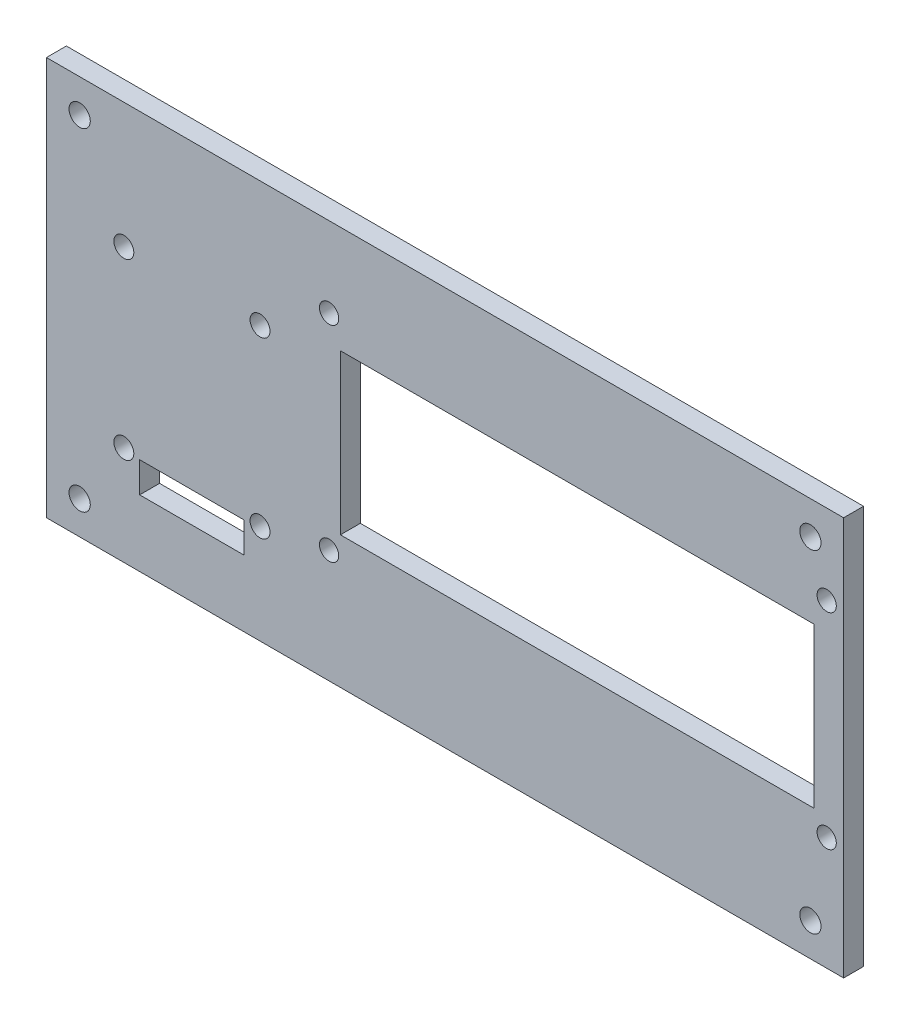
ISO-10303-21;
HEADER;
FILE_DESCRIPTION(('STEP AP214'),'2;1');
FILE_NAME('part.step','',(''),(''),'','','');
FILE_SCHEMA(('AUTOMOTIVE_DESIGN { 1 0 10303 214 1 1 1 1 }'));
ENDSEC;
DATA;
#1=APPLICATION_CONTEXT('core data for automotive mechanical design processes');
#2=APPLICATION_PROTOCOL_DEFINITION('international standard','automotive_design',2000,#1);
#3=PRODUCT_CONTEXT('',#1,'mechanical');
#4=PRODUCT('Part','Part','',(#3));
#5=PRODUCT_RELATED_PRODUCT_CATEGORY('part','',(#4));
#6=PRODUCT_DEFINITION_FORMATION('','',#4);
#7=PRODUCT_DEFINITION_CONTEXT('part definition',#1,'design');
#8=PRODUCT_DEFINITION('design','',#6,#7);
#9=PRODUCT_DEFINITION_SHAPE('','',#8);
#10=(LENGTH_UNIT() NAMED_UNIT(*) SI_UNIT(.MILLI.,.METRE.));
#11=(NAMED_UNIT(*) PLANE_ANGLE_UNIT() SI_UNIT($,.RADIAN.));
#12=(NAMED_UNIT(*) SI_UNIT($,.STERADIAN.) SOLID_ANGLE_UNIT());
#13=UNCERTAINTY_MEASURE_WITH_UNIT(LENGTH_MEASURE(1.E-05),#10,'distance_accuracy_value','');
#14=(GEOMETRIC_REPRESENTATION_CONTEXT(3) GLOBAL_UNCERTAINTY_ASSIGNED_CONTEXT((#13)) GLOBAL_UNIT_ASSIGNED_CONTEXT((#10,
#11,#12)) REPRESENTATION_CONTEXT('',''));
#15=CARTESIAN_POINT('',(0.,0.,0.));
#16=DIRECTION('',(0.,0.,1.));
#17=DIRECTION('',(1.,0.,0.));
#18=AXIS2_PLACEMENT_3D('',#15,#16,#17);
#19=CARTESIAN_POINT('',(-56.9074242581543,24.3699731903485,3.));
#20=DIRECTION('',(1.,0.,0.));
#21=DIRECTION('',(0.,1.,0.));
#22=AXIS2_PLACEMENT_3D('',#19,#20,#21);
#23=PLANE('',#22);
#24=DIRECTION('',(0.,-1.,0.));
#25=VECTOR('',#24,1.);
#26=CARTESIAN_POINT('',(-56.9074242581543,24.3699731903485,0.));
#27=LINE('',#26,#25);
#28=CARTESIAN_POINT('',(-56.9074242581543,24.3699731903485,0.));
#29=VERTEX_POINT('',#28);
#30=CARTESIAN_POINT('',(-56.9074242581543,-35.6300268096515,0.));
#31=VERTEX_POINT('',#30);
#32=EDGE_CURVE('E244',#29,#31,#27,.T.);
#33=ORIENTED_EDGE('',*,*,#32,.T.);
#34=DIRECTION('',(0.,0.,-1.));
#35=VECTOR('',#34,1.);
#36=CARTESIAN_POINT('',(-56.9074242581543,-35.6300268096515,3.));
#37=LINE('',#36,#35);
#38=CARTESIAN_POINT('',(-56.9074242581543,-35.6300268096515,3.));
#39=VERTEX_POINT('',#38);
#40=EDGE_CURVE('E11',#39,#31,#37,.T.);
#41=ORIENTED_EDGE('',*,*,#40,.F.);
#42=DIRECTION('',(0.,-1.,0.));
#43=VECTOR('',#42,1.);
#44=CARTESIAN_POINT('',(-56.9074242581543,24.3699731903485,3.));
#45=LINE('',#44,#43);
#46=CARTESIAN_POINT('',(-56.9074242581543,24.3699731903485,3.));
#47=VERTEX_POINT('',#46);
#48=EDGE_CURVE('E247',#47,#39,#45,.T.);
#49=ORIENTED_EDGE('',*,*,#48,.F.);
#50=DIRECTION('',(0.,0.,-1.));
#51=VECTOR('',#50,1.);
#52=CARTESIAN_POINT('',(-56.9074242581543,24.3699731903485,3.));
#53=LINE('',#52,#51);
#54=EDGE_CURVE('E257',#47,#29,#53,.T.);
#55=ORIENTED_EDGE('',*,*,#54,.T.);
#56=EDGE_LOOP('',(#33,#41,#49,#55));
#57=FACE_BOUND('',#56,.T.);
#58=ADVANCED_FACE('F32',(#57),#23,.F.);
#59=CARTESIAN_POINT('',(-56.9074242581543,-35.6300268096515,3.));
#60=DIRECTION('',(0.,1.,0.));
#61=DIRECTION('',(0.,0.,1.));
#62=AXIS2_PLACEMENT_3D('',#59,#60,#61);
#63=PLANE('',#62);
#64=DIRECTION('',(1.,0.,0.));
#65=VECTOR('',#64,1.);
#66=CARTESIAN_POINT('',(-56.9074242581543,-35.6300268096515,0.));
#67=LINE('',#66,#65);
#68=CARTESIAN_POINT('',(63.0925757418457,-35.6300268096515,0.));
#69=VERTEX_POINT('',#68);
#70=EDGE_CURVE('E260',#31,#69,#67,.T.);
#71=ORIENTED_EDGE('',*,*,#70,.T.);
#72=DIRECTION('',(0.,0.,-1.));
#73=VECTOR('',#72,1.);
#74=CARTESIAN_POINT('',(63.0925757418457,-35.6300268096515,3.));
#75=LINE('',#74,#73);
#76=CARTESIAN_POINT('',(63.0925757418457,-35.6300268096515,3.));
#77=VERTEX_POINT('',#76);
#78=EDGE_CURVE('E39',#77,#69,#75,.T.);
#79=ORIENTED_EDGE('',*,*,#78,.F.);
#80=DIRECTION('',(1.,0.,0.));
#81=VECTOR('',#80,1.);
#82=CARTESIAN_POINT('',(-56.9074242581543,-35.6300268096515,3.));
#83=LINE('',#82,#81);
#84=EDGE_CURVE('E250',#39,#77,#83,.T.);
#85=ORIENTED_EDGE('',*,*,#84,.F.);
#86=ORIENTED_EDGE('',*,*,#40,.T.);
#87=EDGE_LOOP('',(#71,#79,#85,#86));
#88=FACE_BOUND('',#87,.T.);
#89=ADVANCED_FACE('F289',(#88),#63,.F.);
#90=CARTESIAN_POINT('',(63.0925757418457,24.3699731903485,3.));
#91=DIRECTION('',(-1.,0.,0.));
#92=DIRECTION('',(0.,0.,1.));
#93=AXIS2_PLACEMENT_3D('',#90,#91,#92);
#94=PLANE('',#93);
#95=DIRECTION('',(0.,1.,0.));
#96=VECTOR('',#95,1.);
#97=CARTESIAN_POINT('',(63.0925757418457,24.3699731903485,0.));
#98=LINE('',#97,#96);
#99=CARTESIAN_POINT('',(63.0925757418457,24.3699731903485,0.));
#100=VERTEX_POINT('',#99);
#101=EDGE_CURVE('E262',#69,#100,#98,.T.);
#102=ORIENTED_EDGE('',*,*,#101,.T.);
#103=DIRECTION('',(0.,0.,-1.));
#104=VECTOR('',#103,1.);
#105=CARTESIAN_POINT('',(63.0925757418457,24.3699731903485,3.));
#106=LINE('',#105,#104);
#107=CARTESIAN_POINT('',(63.0925757418457,24.3699731903485,3.));
#108=VERTEX_POINT('',#107);
#109=EDGE_CURVE('E267',#108,#100,#106,.T.);
#110=ORIENTED_EDGE('',*,*,#109,.F.);
#111=DIRECTION('',(0.,1.,0.));
#112=VECTOR('',#111,1.);
#113=CARTESIAN_POINT('',(63.0925757418457,24.3699731903485,3.));
#114=LINE('',#113,#112);
#115=EDGE_CURVE('E253',#77,#108,#114,.T.);
#116=ORIENTED_EDGE('',*,*,#115,.F.);
#117=ORIENTED_EDGE('',*,*,#78,.T.);
#118=EDGE_LOOP('',(#102,#110,#116,#117));
#119=FACE_BOUND('',#118,.T.);
#120=ADVANCED_FACE('F274',(#119),#94,.F.);
#121=CARTESIAN_POINT('',(-56.9074242581543,24.3699731903485,3.));
#122=DIRECTION('',(0.,-1.,0.));
#123=DIRECTION('',(0.,0.,-1.));
#124=AXIS2_PLACEMENT_3D('',#121,#122,#123);
#125=PLANE('',#124);
#126=DIRECTION('',(-1.,0.,0.));
#127=VECTOR('',#126,1.);
#128=CARTESIAN_POINT('',(-56.9074242581543,24.3699731903485,0.));
#129=LINE('',#128,#127);
#130=EDGE_CURVE('E251',#100,#29,#129,.T.);
#131=ORIENTED_EDGE('',*,*,#130,.T.);
#132=ORIENTED_EDGE('',*,*,#54,.F.);
#133=DIRECTION('',(-1.,0.,0.));
#134=VECTOR('',#133,1.);
#135=CARTESIAN_POINT('',(-56.9074242581543,24.3699731903485,3.));
#136=LINE('',#135,#134);
#137=EDGE_CURVE('E255',#108,#47,#136,.T.);
#138=ORIENTED_EDGE('',*,*,#137,.F.);
#139=ORIENTED_EDGE('',*,*,#109,.T.);
#140=EDGE_LOOP('',(#131,#132,#138,#139));
#141=FACE_BOUND('',#140,.T.);
#142=ADVANCED_FACE('F282',(#141),#125,.F.);
#143=CARTESIAN_POINT('',(0.,0.,3.));
#144=DIRECTION('',(0.,0.,1.));
#145=DIRECTION('',(1.,0.,0.));
#146=AXIS2_PLACEMENT_3D('',#143,#144,#145);
#147=PLANE('',#146);
#148=DIRECTION('',(0.,-1.,0.));
#149=VECTOR('',#148,1.);
#150=CARTESIAN_POINT('',(-42.8746504453613,-25.6300268096515,3.));
#151=LINE('',#150,#149);
#152=CARTESIAN_POINT('',(-42.8746504453613,-21.0438341045319,3.));
#153=VERTEX_POINT('',#152);
#154=CARTESIAN_POINT('',(-42.8746504453613,-25.6300268096515,3.));
#155=VERTEX_POINT('',#154);
#156=EDGE_CURVE('E46',#153,#155,#151,.T.);
#157=ORIENTED_EDGE('',*,*,#156,.F.);
#158=DIRECTION('',(-1.,0.,0.));
#159=VECTOR('',#158,1.);
#160=CARTESIAN_POINT('',(-42.8746504453613,-21.0438341045319,3.));
#161=LINE('',#160,#159);
#162=CARTESIAN_POINT('',(-27.184872325898,-21.0438341045319,3.));
#163=VERTEX_POINT('',#162);
#164=EDGE_CURVE('E138',#163,#153,#161,.T.);
#165=ORIENTED_EDGE('',*,*,#164,.F.);
#166=DIRECTION('',(0.,1.,0.));
#167=VECTOR('',#166,1.);
#168=CARTESIAN_POINT('',(-27.184872325898,-25.6300268096515,3.));
#169=LINE('',#168,#167);
#170=CARTESIAN_POINT('',(-27.184872325898,-25.6300268096515,3.));
#171=VERTEX_POINT('',#170);
#172=EDGE_CURVE('E141',#171,#163,#169,.T.);
#173=ORIENTED_EDGE('',*,*,#172,.F.);
#174=DIRECTION('',(1.,0.,0.));
#175=VECTOR('',#174,1.);
#176=CARTESIAN_POINT('',(-42.8746504453613,-25.6300268096515,3.));
#177=LINE('',#176,#175);
#178=EDGE_CURVE('E150',#155,#171,#177,.T.);
#179=ORIENTED_EDGE('',*,*,#178,.F.);
#180=EDGE_LOOP('',(#157,#165,#173,#179));
#181=FACE_BOUND('',#180,.T.);
#182=CARTESIAN_POINT('',(-45.2574242581544,-20.6800268096515,3.));
#183=DIRECTION('',(0.,0.,1.));
#184=DIRECTION('',(1.,0.,0.));
#185=AXIS2_PLACEMENT_3D('',#182,#183,#184);
#186=CIRCLE('',#185,1.5);
#187=CARTESIAN_POINT('',(-43.7574242581544,-20.6800268096515,3.));
#188=VERTEX_POINT('',#187);
#189=EDGE_CURVE('E144',#188,#188,#186,.T.);
#190=ORIENTED_EDGE('',*,*,#189,.F.);
#191=EDGE_LOOP('',(#190));
#192=FACE_BOUND('',#191,.T.);
#193=CARTESIAN_POINT('',(-24.7574242581543,-20.6800268096515,3.));
#194=DIRECTION('',(0.,0.,1.));
#195=DIRECTION('',(1.,0.,0.));
#196=AXIS2_PLACEMENT_3D('',#193,#194,#195);
#197=CIRCLE('',#196,1.5);
#198=CARTESIAN_POINT('',(-23.2574242581543,-20.6800268096515,3.));
#199=VERTEX_POINT('',#198);
#200=EDGE_CURVE('E391',#199,#199,#197,.T.);
#201=ORIENTED_EDGE('',*,*,#200,.F.);
#202=EDGE_LOOP('',(#201));
#203=FACE_BOUND('',#202,.T.);
#204=CARTESIAN_POINT('',(-24.7574242581543,5.51997319034853,3.));
#205=DIRECTION('',(0.,0.,1.));
#206=DIRECTION('',(1.,0.,0.));
#207=AXIS2_PLACEMENT_3D('',#204,#205,#206);
#208=CIRCLE('',#207,1.5);
#209=CARTESIAN_POINT('',(-23.2574242581543,5.51997319034853,3.));
#210=VERTEX_POINT('',#209);
#211=EDGE_CURVE('E385',#210,#210,#208,.T.);
#212=ORIENTED_EDGE('',*,*,#211,.F.);
#213=EDGE_LOOP('',(#212));
#214=FACE_BOUND('',#213,.T.);
#215=CARTESIAN_POINT('',(-45.2574242581544,5.51997319034853,3.));
#216=DIRECTION('',(0.,0.,1.));
#217=DIRECTION('',(1.,0.,0.));
#218=AXIS2_PLACEMENT_3D('',#215,#216,#217);
#219=CIRCLE('',#218,1.5);
#220=CARTESIAN_POINT('',(-43.7574242581544,5.51997319034853,3.));
#221=VERTEX_POINT('',#220);
#222=EDGE_CURVE('E163',#221,#221,#219,.T.);
#223=ORIENTED_EDGE('',*,*,#222,.F.);
#224=EDGE_LOOP('',(#223));
#225=FACE_BOUND('',#224,.T.);
#226=DIRECTION('',(0.,-1.,0.));
#227=VECTOR('',#226,1.);
#228=CARTESIAN_POINT('',(-12.6574242581543,8.26997319034854,3.));
#229=LINE('',#228,#227);
#230=CARTESIAN_POINT('',(-12.6574242581543,8.26997319034854,3.));
#231=VERTEX_POINT('',#230);
#232=CARTESIAN_POINT('',(-12.6574242581543,-15.7300268096515,3.));
#233=VERTEX_POINT('',#232);
#234=EDGE_CURVE('E162',#231,#233,#229,.T.);
#235=ORIENTED_EDGE('',*,*,#234,.F.);
#236=DIRECTION('',(-1.,0.,0.));
#237=VECTOR('',#236,1.);
#238=CARTESIAN_POINT('',(-12.6574242581543,8.26997319034854,3.));
#239=LINE('',#238,#237);
#240=CARTESIAN_POINT('',(58.6425757418457,8.26997319034854,3.));
#241=VERTEX_POINT('',#240);
#242=EDGE_CURVE('E171',#241,#231,#239,.T.);
#243=ORIENTED_EDGE('',*,*,#242,.F.);
#244=DIRECTION('',(0.,1.,0.));
#245=VECTOR('',#244,1.);
#246=CARTESIAN_POINT('',(58.6425757418457,8.26997319034854,3.));
#247=LINE('',#246,#245);
#248=CARTESIAN_POINT('',(58.6425757418457,-15.7300268096515,3.));
#249=VERTEX_POINT('',#248);
#250=EDGE_CURVE('E185',#249,#241,#247,.T.);
#251=ORIENTED_EDGE('',*,*,#250,.F.);
#252=DIRECTION('',(1.,0.,0.));
#253=VECTOR('',#252,1.);
#254=CARTESIAN_POINT('',(-12.6574242581543,-15.7300268096515,3.));
#255=LINE('',#254,#253);
#256=EDGE_CURVE('E182',#233,#249,#255,.T.);
#257=ORIENTED_EDGE('',*,*,#256,.F.);
#258=EDGE_LOOP('',(#235,#243,#251,#257));
#259=FACE_BOUND('',#258,.T.);
#260=CARTESIAN_POINT('',(60.5425757418456,12.3199731903485,3.));
#261=DIRECTION('',(0.,0.,-1.));
#262=DIRECTION('',(-1.,0.,0.));
#263=AXIS2_PLACEMENT_3D('',#260,#261,#262);
#264=CIRCLE('',#263,1.45);
#265=CARTESIAN_POINT('',(59.0925757418456,12.3199731903485,3.));
#266=VERTEX_POINT('',#265);
#267=EDGE_CURVE('E212',#266,#266,#264,.T.);
#268=ORIENTED_EDGE('',*,*,#267,.T.);
#269=EDGE_LOOP('',(#268));
#270=FACE_BOUND('',#269,.T.);
#271=CARTESIAN_POINT('',(60.5425757418456,-18.5800268096515,3.));
#272=DIRECTION('',(0.,0.,-1.));
#273=DIRECTION('',(-1.,0.,0.));
#274=AXIS2_PLACEMENT_3D('',#271,#272,#273);
#275=CIRCLE('',#274,1.45);
#276=CARTESIAN_POINT('',(59.0925757418456,-18.5800268096515,3.));
#277=VERTEX_POINT('',#276);
#278=EDGE_CURVE('E206',#277,#277,#275,.T.);
#279=ORIENTED_EDGE('',*,*,#278,.T.);
#280=EDGE_LOOP('',(#279));
#281=FACE_BOUND('',#280,.T.);
#282=CARTESIAN_POINT('',(-14.3574242581543,-18.5800268096515,3.));
#283=DIRECTION('',(0.,0.,-1.));
#284=DIRECTION('',(-1.,0.,0.));
#285=AXIS2_PLACEMENT_3D('',#282,#283,#284);
#286=CIRCLE('',#285,1.45);
#287=CARTESIAN_POINT('',(-15.8074242581543,-18.5800268096515,3.));
#288=VERTEX_POINT('',#287);
#289=EDGE_CURVE('E199',#288,#288,#286,.T.);
#290=ORIENTED_EDGE('',*,*,#289,.T.);
#291=EDGE_LOOP('',(#290));
#292=FACE_BOUND('',#291,.T.);
#293=CARTESIAN_POINT('',(-14.3574242581543,12.3199731903485,3.));
#294=DIRECTION('',(0.,0.,-1.));
#295=DIRECTION('',(-1.,0.,0.));
#296=AXIS2_PLACEMENT_3D('',#293,#294,#295);
#297=CIRCLE('',#296,1.45);
#298=CARTESIAN_POINT('',(-15.8074242581543,12.3199731903485,3.));
#299=VERTEX_POINT('',#298);
#300=EDGE_CURVE('E217',#299,#299,#297,.T.);
#301=ORIENTED_EDGE('',*,*,#300,.T.);
#302=EDGE_LOOP('',(#301));
#303=FACE_BOUND('',#302,.T.);
#304=CARTESIAN_POINT('',(-51.9074242581543,19.3699731903485,3.));
#305=DIRECTION('',(0.,0.,1.));
#306=DIRECTION('',(1.,0.,0.));
#307=AXIS2_PLACEMENT_3D('',#304,#305,#306);
#308=CIRCLE('',#307,1.6);
#309=CARTESIAN_POINT('',(-50.3074242581543,19.3699731903485,3.));
#310=VERTEX_POINT('',#309);
#311=EDGE_CURVE('E220',#310,#310,#308,.T.);
#312=ORIENTED_EDGE('',*,*,#311,.F.);
#313=EDGE_LOOP('',(#312));
#314=FACE_BOUND('',#313,.T.);
#315=CARTESIAN_POINT('',(-51.9074242581543,-30.6300268096515,3.));
#316=DIRECTION('',(0.,0.,1.));
#317=DIRECTION('',(1.,0.,0.));
#318=AXIS2_PLACEMENT_3D('',#315,#316,#317);
#319=CIRCLE('',#318,1.6);
#320=CARTESIAN_POINT('',(-50.3074242581543,-30.6300268096515,3.));
#321=VERTEX_POINT('',#320);
#322=EDGE_CURVE('E233',#321,#321,#319,.T.);
#323=ORIENTED_EDGE('',*,*,#322,.F.);
#324=EDGE_LOOP('',(#323));
#325=FACE_BOUND('',#324,.T.);
#326=CARTESIAN_POINT('',(58.0925757418457,-30.6300268096515,3.));
#327=DIRECTION('',(0.,0.,1.));
#328=DIRECTION('',(1.,0.,0.));
#329=AXIS2_PLACEMENT_3D('',#326,#327,#328);
#330=CIRCLE('',#329,1.6);
#331=CARTESIAN_POINT('',(59.6925757418457,-30.6300268096515,3.));
#332=VERTEX_POINT('',#331);
#333=EDGE_CURVE('E227',#332,#332,#330,.T.);
#334=ORIENTED_EDGE('',*,*,#333,.F.);
#335=EDGE_LOOP('',(#334));
#336=FACE_BOUND('',#335,.T.);
#337=CARTESIAN_POINT('',(58.0925757418457,19.3699731903485,3.));
#338=DIRECTION('',(0.,0.,1.));
#339=DIRECTION('',(1.,0.,0.));
#340=AXIS2_PLACEMENT_3D('',#337,#338,#339);
#341=CIRCLE('',#340,1.6);
#342=CARTESIAN_POINT('',(59.6925757418457,19.3699731903485,3.));
#343=VERTEX_POINT('',#342);
#344=EDGE_CURVE('E226',#343,#343,#341,.T.);
#345=ORIENTED_EDGE('',*,*,#344,.F.);
#346=EDGE_LOOP('',(#345));
#347=FACE_BOUND('',#346,.T.);
#348=ORIENTED_EDGE('',*,*,#48,.T.);
#349=ORIENTED_EDGE('',*,*,#84,.T.);
#350=ORIENTED_EDGE('',*,*,#115,.T.);
#351=ORIENTED_EDGE('',*,*,#137,.T.);
#352=EDGE_LOOP('',(#348,#349,#350,#351));
#353=FACE_BOUND('',#352,.T.);
#354=ADVANCED_FACE('F288',(#181,#192,#203,#214,#225,#259,#270,#281,#292,#303,#314,#325,#336,
#347,#353),#147,.T.);
#355=CARTESIAN_POINT('',(0.,0.,0.));
#356=DIRECTION('',(0.,0.,1.));
#357=DIRECTION('',(1.,0.,0.));
#358=AXIS2_PLACEMENT_3D('',#355,#356,#357);
#359=PLANE('',#358);
#360=DIRECTION('',(-1.,0.,0.));
#361=VECTOR('',#360,1.);
#362=CARTESIAN_POINT('',(-42.8746504453613,-21.0438341045319,0.));
#363=LINE('',#362,#361);
#364=CARTESIAN_POINT('',(-27.184872325898,-21.0438341045319,0.));
#365=VERTEX_POINT('',#364);
#366=CARTESIAN_POINT('',(-42.8746504453613,-21.0438341045319,0.));
#367=VERTEX_POINT('',#366);
#368=EDGE_CURVE('E128',#365,#367,#363,.T.);
#369=ORIENTED_EDGE('',*,*,#368,.T.);
#370=DIRECTION('',(0.,-1.,0.));
#371=VECTOR('',#370,1.);
#372=CARTESIAN_POINT('',(-42.8746504453613,-25.6300268096515,0.));
#373=LINE('',#372,#371);
#374=CARTESIAN_POINT('',(-42.8746504453613,-25.6300268096515,0.));
#375=VERTEX_POINT('',#374);
#376=EDGE_CURVE('E122',#367,#375,#373,.T.);
#377=ORIENTED_EDGE('',*,*,#376,.T.);
#378=DIRECTION('',(1.,0.,0.));
#379=VECTOR('',#378,1.);
#380=CARTESIAN_POINT('',(-42.8746504453613,-25.6300268096515,0.));
#381=LINE('',#380,#379);
#382=CARTESIAN_POINT('',(-27.184872325898,-25.6300268096515,0.));
#383=VERTEX_POINT('',#382);
#384=EDGE_CURVE('E131',#375,#383,#381,.T.);
#385=ORIENTED_EDGE('',*,*,#384,.T.);
#386=DIRECTION('',(0.,1.,0.));
#387=VECTOR('',#386,1.);
#388=CARTESIAN_POINT('',(-27.184872325898,-25.6300268096515,0.));
#389=LINE('',#388,#387);
#390=EDGE_CURVE('E54',#383,#365,#389,.T.);
#391=ORIENTED_EDGE('',*,*,#390,.T.);
#392=EDGE_LOOP('',(#369,#377,#385,#391));
#393=FACE_BOUND('',#392,.T.);
#394=CARTESIAN_POINT('',(-45.2574242581544,-20.6800268096515,0.));
#395=DIRECTION('',(0.,0.,1.));
#396=DIRECTION('',(1.,0.,0.));
#397=AXIS2_PLACEMENT_3D('',#394,#395,#396);
#398=CIRCLE('',#397,1.5);
#399=CARTESIAN_POINT('',(-43.7574242581544,-20.6800268096515,0.));
#400=VERTEX_POINT('',#399);
#401=EDGE_CURVE('E395',#400,#400,#398,.T.);
#402=ORIENTED_EDGE('',*,*,#401,.T.);
#403=EDGE_LOOP('',(#402));
#404=FACE_BOUND('',#403,.T.);
#405=CARTESIAN_POINT('',(-24.7574242581543,-20.6800268096515,0.));
#406=DIRECTION('',(0.,0.,1.));
#407=DIRECTION('',(1.,0.,0.));
#408=AXIS2_PLACEMENT_3D('',#405,#406,#407);
#409=CIRCLE('',#408,1.5);
#410=CARTESIAN_POINT('',(-23.2574242581543,-20.6800268096515,0.));
#411=VERTEX_POINT('',#410);
#412=EDGE_CURVE('E387',#411,#411,#409,.T.);
#413=ORIENTED_EDGE('',*,*,#412,.T.);
#414=EDGE_LOOP('',(#413));
#415=FACE_BOUND('',#414,.T.);
#416=CARTESIAN_POINT('',(-24.7574242581543,5.51997319034853,0.));
#417=DIRECTION('',(0.,0.,1.));
#418=DIRECTION('',(1.,0.,0.));
#419=AXIS2_PLACEMENT_3D('',#416,#417,#418);
#420=CIRCLE('',#419,1.5);
#421=CARTESIAN_POINT('',(-23.2574242581543,5.51997319034853,0.));
#422=VERTEX_POINT('',#421);
#423=EDGE_CURVE('E166',#422,#422,#420,.T.);
#424=ORIENTED_EDGE('',*,*,#423,.T.);
#425=EDGE_LOOP('',(#424));
#426=FACE_BOUND('',#425,.T.);
#427=CARTESIAN_POINT('',(-45.2574242581544,5.51997319034853,0.));
#428=DIRECTION('',(0.,0.,1.));
#429=DIRECTION('',(1.,0.,0.));
#430=AXIS2_PLACEMENT_3D('',#427,#428,#429);
#431=CIRCLE('',#430,1.5);
#432=CARTESIAN_POINT('',(-43.7574242581544,5.51997319034853,0.));
#433=VERTEX_POINT('',#432);
#434=EDGE_CURVE('E159',#433,#433,#431,.T.);
#435=ORIENTED_EDGE('',*,*,#434,.T.);
#436=EDGE_LOOP('',(#435));
#437=FACE_BOUND('',#436,.T.);
#438=DIRECTION('',(-1.,0.,0.));
#439=VECTOR('',#438,1.);
#440=CARTESIAN_POINT('',(-12.6574242581543,8.26997319034854,0.));
#441=LINE('',#440,#439);
#442=CARTESIAN_POINT('',(58.6425757418457,8.26997319034854,0.));
#443=VERTEX_POINT('',#442);
#444=CARTESIAN_POINT('',(-12.6574242581543,8.26997319034854,0.));
#445=VERTEX_POINT('',#444);
#446=EDGE_CURVE('E177',#443,#445,#441,.T.);
#447=ORIENTED_EDGE('',*,*,#446,.T.);
#448=DIRECTION('',(0.,-1.,0.));
#449=VECTOR('',#448,1.);
#450=CARTESIAN_POINT('',(-12.6574242581543,8.26997319034854,0.));
#451=LINE('',#450,#449);
#452=CARTESIAN_POINT('',(-12.6574242581543,-15.7300268096515,0.));
#453=VERTEX_POINT('',#452);
#454=EDGE_CURVE('E167',#445,#453,#451,.T.);
#455=ORIENTED_EDGE('',*,*,#454,.T.);
#456=DIRECTION('',(1.,0.,0.));
#457=VECTOR('',#456,1.);
#458=CARTESIAN_POINT('',(-12.6574242581543,-15.7300268096515,0.));
#459=LINE('',#458,#457);
#460=CARTESIAN_POINT('',(58.6425757418457,-15.7300268096515,0.));
#461=VERTEX_POINT('',#460);
#462=EDGE_CURVE('E170',#453,#461,#459,.T.);
#463=ORIENTED_EDGE('',*,*,#462,.T.);
#464=DIRECTION('',(0.,1.,0.));
#465=VECTOR('',#464,1.);
#466=CARTESIAN_POINT('',(58.6425757418457,8.26997319034854,0.));
#467=LINE('',#466,#465);
#468=EDGE_CURVE('E174',#461,#443,#467,.T.);
#469=ORIENTED_EDGE('',*,*,#468,.T.);
#470=EDGE_LOOP('',(#447,#455,#463,#469));
#471=FACE_BOUND('',#470,.T.);
#472=CARTESIAN_POINT('',(60.5425757418456,12.3199731903485,0.));
#473=DIRECTION('',(0.,0.,-1.));
#474=DIRECTION('',(-1.,0.,0.));
#475=AXIS2_PLACEMENT_3D('',#472,#473,#474);
#476=CIRCLE('',#475,1.45);
#477=CARTESIAN_POINT('',(59.0925757418456,12.3199731903485,0.));
#478=VERTEX_POINT('',#477);
#479=EDGE_CURVE('E192',#478,#478,#476,.T.);
#480=ORIENTED_EDGE('',*,*,#479,.F.);
#481=EDGE_LOOP('',(#480));
#482=FACE_BOUND('',#481,.T.);
#483=CARTESIAN_POINT('',(60.5425757418456,-18.5800268096515,0.));
#484=DIRECTION('',(0.,0.,-1.));
#485=DIRECTION('',(-1.,0.,0.));
#486=AXIS2_PLACEMENT_3D('',#483,#484,#485);
#487=CIRCLE('',#486,1.45);
#488=CARTESIAN_POINT('',(59.0925757418456,-18.5800268096515,0.));
#489=VERTEX_POINT('',#488);
#490=EDGE_CURVE('E209',#489,#489,#487,.T.);
#491=ORIENTED_EDGE('',*,*,#490,.F.);
#492=EDGE_LOOP('',(#491));
#493=FACE_BOUND('',#492,.T.);
#494=CARTESIAN_POINT('',(-14.3574242581543,-18.5800268096515,0.));
#495=DIRECTION('',(0.,0.,-1.));
#496=DIRECTION('',(-1.,0.,0.));
#497=AXIS2_PLACEMENT_3D('',#494,#495,#496);
#498=CIRCLE('',#497,1.45);
#499=CARTESIAN_POINT('',(-15.8074242581543,-18.5800268096515,0.));
#500=VERTEX_POINT('',#499);
#501=EDGE_CURVE('E203',#500,#500,#498,.T.);
#502=ORIENTED_EDGE('',*,*,#501,.F.);
#503=EDGE_LOOP('',(#502));
#504=FACE_BOUND('',#503,.T.);
#505=CARTESIAN_POINT('',(-14.3574242581543,12.3199731903485,0.));
#506=DIRECTION('',(0.,0.,-1.));
#507=DIRECTION('',(-1.,0.,0.));
#508=AXIS2_PLACEMENT_3D('',#505,#506,#507);
#509=CIRCLE('',#508,1.45);
#510=CARTESIAN_POINT('',(-15.8074242581543,12.3199731903485,0.));
#511=VERTEX_POINT('',#510);
#512=EDGE_CURVE('E202',#511,#511,#509,.T.);
#513=ORIENTED_EDGE('',*,*,#512,.F.);
#514=EDGE_LOOP('',(#513));
#515=FACE_BOUND('',#514,.T.);
#516=CARTESIAN_POINT('',(-51.9074242581543,19.3699731903485,0.));
#517=DIRECTION('',(0.,0.,1.));
#518=DIRECTION('',(1.,0.,0.));
#519=AXIS2_PLACEMENT_3D('',#516,#517,#518);
#520=CIRCLE('',#519,1.6);
#521=CARTESIAN_POINT('',(-50.3074242581543,19.3699731903485,0.));
#522=VERTEX_POINT('',#521);
#523=EDGE_CURVE('E236',#522,#522,#520,.T.);
#524=ORIENTED_EDGE('',*,*,#523,.T.);
#525=EDGE_LOOP('',(#524));
#526=FACE_BOUND('',#525,.T.);
#527=CARTESIAN_POINT('',(-51.9074242581543,-30.6300268096515,0.));
#528=DIRECTION('',(0.,0.,1.));
#529=DIRECTION('',(1.,0.,0.));
#530=AXIS2_PLACEMENT_3D('',#527,#528,#529);
#531=CIRCLE('',#530,1.6);
#532=CARTESIAN_POINT('',(-50.3074242581543,-30.6300268096515,0.));
#533=VERTEX_POINT('',#532);
#534=EDGE_CURVE('E230',#533,#533,#531,.T.);
#535=ORIENTED_EDGE('',*,*,#534,.T.);
#536=EDGE_LOOP('',(#535));
#537=FACE_BOUND('',#536,.T.);
#538=CARTESIAN_POINT('',(58.0925757418457,-30.6300268096515,0.));
#539=DIRECTION('',(0.,0.,1.));
#540=DIRECTION('',(1.,0.,0.));
#541=AXIS2_PLACEMENT_3D('',#538,#539,#540);
#542=CIRCLE('',#541,1.6);
#543=CARTESIAN_POINT('',(59.6925757418457,-30.6300268096515,0.));
#544=VERTEX_POINT('',#543);
#545=EDGE_CURVE('E223',#544,#544,#542,.T.);
#546=ORIENTED_EDGE('',*,*,#545,.T.);
#547=EDGE_LOOP('',(#546));
#548=FACE_BOUND('',#547,.T.);
#549=CARTESIAN_POINT('',(58.0925757418457,19.3699731903485,0.));
#550=DIRECTION('',(0.,0.,1.));
#551=DIRECTION('',(1.,0.,0.));
#552=AXIS2_PLACEMENT_3D('',#549,#550,#551);
#553=CIRCLE('',#552,1.6);
#554=CARTESIAN_POINT('',(59.6925757418457,19.3699731903485,0.));
#555=VERTEX_POINT('',#554);
#556=EDGE_CURVE('E241',#555,#555,#553,.T.);
#557=ORIENTED_EDGE('',*,*,#556,.T.);
#558=EDGE_LOOP('',(#557));
#559=FACE_BOUND('',#558,.T.);
#560=ORIENTED_EDGE('',*,*,#32,.F.);
#561=ORIENTED_EDGE('',*,*,#130,.F.);
#562=ORIENTED_EDGE('',*,*,#101,.F.);
#563=ORIENTED_EDGE('',*,*,#70,.F.);
#564=EDGE_LOOP('',(#560,#561,#562,#563));
#565=FACE_BOUND('',#564,.T.);
#566=ADVANCED_FACE('F135',(#393,#404,#415,#426,#437,#471,#482,#493,#504,#515,#526,#537,#548,
#559,#565),#359,.F.);
#567=CARTESIAN_POINT('',(58.0925757418457,19.3699731903485,0.));
#568=DIRECTION('',(0.,0.,1.));
#569=DIRECTION('',(1.,0.,0.));
#570=AXIS2_PLACEMENT_3D('',#567,#568,#569);
#571=CYLINDRICAL_SURFACE('',#570,1.6);
#572=ORIENTED_EDGE('',*,*,#556,.F.);
#573=EDGE_LOOP('',(#572));
#574=FACE_BOUND('',#573,.T.);
#575=ORIENTED_EDGE('',*,*,#344,.T.);
#576=EDGE_LOOP('',(#575));
#577=FACE_BOUND('',#576,.T.);
#578=ADVANCED_FACE('F301',(#574,#577),#571,.F.);
#579=CARTESIAN_POINT('',(58.0925757418457,-30.6300268096515,0.));
#580=DIRECTION('',(0.,0.,1.));
#581=DIRECTION('',(1.,0.,0.));
#582=AXIS2_PLACEMENT_3D('',#579,#580,#581);
#583=CYLINDRICAL_SURFACE('',#582,1.6);
#584=ORIENTED_EDGE('',*,*,#545,.F.);
#585=EDGE_LOOP('',(#584));
#586=FACE_BOUND('',#585,.T.);
#587=ORIENTED_EDGE('',*,*,#333,.T.);
#588=EDGE_LOOP('',(#587));
#589=FACE_BOUND('',#588,.T.);
#590=ADVANCED_FACE('F307',(#586,#589),#583,.F.);
#591=CARTESIAN_POINT('',(-51.9074242581543,-30.6300268096515,0.));
#592=DIRECTION('',(0.,0.,1.));
#593=DIRECTION('',(1.,0.,0.));
#594=AXIS2_PLACEMENT_3D('',#591,#592,#593);
#595=CYLINDRICAL_SURFACE('',#594,1.6);
#596=ORIENTED_EDGE('',*,*,#534,.F.);
#597=EDGE_LOOP('',(#596));
#598=FACE_BOUND('',#597,.T.);
#599=ORIENTED_EDGE('',*,*,#322,.T.);
#600=EDGE_LOOP('',(#599));
#601=FACE_BOUND('',#600,.T.);
#602=ADVANCED_FACE('F313',(#598,#601),#595,.F.);
#603=CARTESIAN_POINT('',(-51.9074242581543,19.3699731903485,0.));
#604=DIRECTION('',(0.,0.,1.));
#605=DIRECTION('',(1.,0.,0.));
#606=AXIS2_PLACEMENT_3D('',#603,#604,#605);
#607=CYLINDRICAL_SURFACE('',#606,1.6);
#608=ORIENTED_EDGE('',*,*,#523,.F.);
#609=EDGE_LOOP('',(#608));
#610=FACE_BOUND('',#609,.T.);
#611=ORIENTED_EDGE('',*,*,#311,.T.);
#612=EDGE_LOOP('',(#611));
#613=FACE_BOUND('',#612,.T.);
#614=ADVANCED_FACE('F309',(#610,#613),#607,.F.);
#615=CARTESIAN_POINT('',(-14.3574242581543,12.3199731903485,3.));
#616=DIRECTION('',(0.,0.,-1.));
#617=DIRECTION('',(-1.,0.,0.));
#618=AXIS2_PLACEMENT_3D('',#615,#616,#617);
#619=CYLINDRICAL_SURFACE('',#618,1.45);
#620=ORIENTED_EDGE('',*,*,#300,.F.);
#621=EDGE_LOOP('',(#620));
#622=FACE_BOUND('',#621,.T.);
#623=ORIENTED_EDGE('',*,*,#512,.T.);
#624=EDGE_LOOP('',(#623));
#625=FACE_BOUND('',#624,.T.);
#626=ADVANCED_FACE('F312',(#622,#625),#619,.F.);
#627=CARTESIAN_POINT('',(-14.3574242581543,-18.5800268096515,3.));
#628=DIRECTION('',(0.,0.,-1.));
#629=DIRECTION('',(-1.,0.,0.));
#630=AXIS2_PLACEMENT_3D('',#627,#628,#629);
#631=CYLINDRICAL_SURFACE('',#630,1.45);
#632=ORIENTED_EDGE('',*,*,#289,.F.);
#633=EDGE_LOOP('',(#632));
#634=FACE_BOUND('',#633,.T.);
#635=ORIENTED_EDGE('',*,*,#501,.T.);
#636=EDGE_LOOP('',(#635));
#637=FACE_BOUND('',#636,.T.);
#638=ADVANCED_FACE('F323',(#634,#637),#631,.F.);
#639=CARTESIAN_POINT('',(60.5425757418456,-18.5800268096515,3.));
#640=DIRECTION('',(0.,0.,-1.));
#641=DIRECTION('',(-1.,0.,0.));
#642=AXIS2_PLACEMENT_3D('',#639,#640,#641);
#643=CYLINDRICAL_SURFACE('',#642,1.45);
#644=ORIENTED_EDGE('',*,*,#278,.F.);
#645=EDGE_LOOP('',(#644));
#646=FACE_BOUND('',#645,.T.);
#647=ORIENTED_EDGE('',*,*,#490,.T.);
#648=EDGE_LOOP('',(#647));
#649=FACE_BOUND('',#648,.T.);
#650=ADVANCED_FACE('F329',(#646,#649),#643,.F.);
#651=CARTESIAN_POINT('',(60.5425757418456,12.3199731903485,3.));
#652=DIRECTION('',(0.,0.,-1.));
#653=DIRECTION('',(-1.,0.,0.));
#654=AXIS2_PLACEMENT_3D('',#651,#652,#653);
#655=CYLINDRICAL_SURFACE('',#654,1.45);
#656=ORIENTED_EDGE('',*,*,#267,.F.);
#657=EDGE_LOOP('',(#656));
#658=FACE_BOUND('',#657,.T.);
#659=ORIENTED_EDGE('',*,*,#479,.T.);
#660=EDGE_LOOP('',(#659));
#661=FACE_BOUND('',#660,.T.);
#662=ADVANCED_FACE('F325',(#658,#661),#655,.F.);
#663=CARTESIAN_POINT('',(-12.6574242581543,8.26997319034854,0.));
#664=DIRECTION('',(-1.,0.,0.));
#665=DIRECTION('',(0.,0.,1.));
#666=AXIS2_PLACEMENT_3D('',#663,#664,#665);
#667=PLANE('',#666);
#668=ORIENTED_EDGE('',*,*,#234,.T.);
#669=DIRECTION('',(0.,0.,1.));
#670=VECTOR('',#669,1.);
#671=CARTESIAN_POINT('',(-12.6574242581543,-15.7300268096515,0.));
#672=LINE('',#671,#670);
#673=EDGE_CURVE('E180',#453,#233,#672,.T.);
#674=ORIENTED_EDGE('',*,*,#673,.F.);
#675=ORIENTED_EDGE('',*,*,#454,.F.);
#676=DIRECTION('',(0.,0.,1.));
#677=VECTOR('',#676,1.);
#678=CARTESIAN_POINT('',(-12.6574242581543,8.26997319034854,0.));
#679=LINE('',#678,#677);
#680=EDGE_CURVE('E190',#445,#231,#679,.T.);
#681=ORIENTED_EDGE('',*,*,#680,.T.);
#682=EDGE_LOOP('',(#668,#674,#675,#681));
#683=FACE_BOUND('',#682,.T.);
#684=ADVANCED_FACE('F328',(#683),#667,.F.);
#685=CARTESIAN_POINT('',(-12.6574242581543,8.26997319034854,0.));
#686=DIRECTION('',(0.,1.,0.));
#687=DIRECTION('',(0.,0.,1.));
#688=AXIS2_PLACEMENT_3D('',#685,#686,#687);
#689=PLANE('',#688);
#690=ORIENTED_EDGE('',*,*,#242,.T.);
#691=ORIENTED_EDGE('',*,*,#680,.F.);
#692=ORIENTED_EDGE('',*,*,#446,.F.);
#693=DIRECTION('',(0.,0.,1.));
#694=VECTOR('',#693,1.);
#695=CARTESIAN_POINT('',(58.6425757418457,8.26997319034854,0.));
#696=LINE('',#695,#694);
#697=EDGE_CURVE('E193',#443,#241,#696,.T.);
#698=ORIENTED_EDGE('',*,*,#697,.T.);
#699=EDGE_LOOP('',(#690,#691,#692,#698));
#700=FACE_BOUND('',#699,.T.);
#701=ADVANCED_FACE('F339',(#700),#689,.F.);
#702=CARTESIAN_POINT('',(58.6425757418457,8.26997319034854,0.));
#703=DIRECTION('',(1.,0.,0.));
#704=DIRECTION('',(0.,0.,-1.));
#705=AXIS2_PLACEMENT_3D('',#702,#703,#704);
#706=PLANE('',#705);
#707=ORIENTED_EDGE('',*,*,#250,.T.);
#708=ORIENTED_EDGE('',*,*,#697,.F.);
#709=ORIENTED_EDGE('',*,*,#468,.F.);
#710=DIRECTION('',(0.,0.,1.));
#711=VECTOR('',#710,1.);
#712=CARTESIAN_POINT('',(58.6425757418457,-15.7300268096515,0.));
#713=LINE('',#712,#711);
#714=EDGE_CURVE('E195',#461,#249,#713,.T.);
#715=ORIENTED_EDGE('',*,*,#714,.T.);
#716=EDGE_LOOP('',(#707,#708,#709,#715));
#717=FACE_BOUND('',#716,.T.);
#718=ADVANCED_FACE('F345',(#717),#706,.F.);
#719=CARTESIAN_POINT('',(-12.6574242581543,-15.7300268096515,0.));
#720=DIRECTION('',(0.,-1.,0.));
#721=DIRECTION('',(0.,0.,-1.));
#722=AXIS2_PLACEMENT_3D('',#719,#720,#721);
#723=PLANE('',#722);
#724=ORIENTED_EDGE('',*,*,#256,.T.);
#725=ORIENTED_EDGE('',*,*,#714,.F.);
#726=ORIENTED_EDGE('',*,*,#462,.F.);
#727=ORIENTED_EDGE('',*,*,#673,.T.);
#728=EDGE_LOOP('',(#724,#725,#726,#727));
#729=FACE_BOUND('',#728,.T.);
#730=ADVANCED_FACE('F341',(#729),#723,.F.);
#731=CARTESIAN_POINT('',(-45.2574242581544,5.51997319034853,0.));
#732=DIRECTION('',(0.,0.,1.));
#733=DIRECTION('',(1.,0.,0.));
#734=AXIS2_PLACEMENT_3D('',#731,#732,#733);
#735=CYLINDRICAL_SURFACE('',#734,1.5);
#736=ORIENTED_EDGE('',*,*,#434,.F.);
#737=EDGE_LOOP('',(#736));
#738=FACE_BOUND('',#737,.T.);
#739=ORIENTED_EDGE('',*,*,#222,.T.);
#740=EDGE_LOOP('',(#739));
#741=FACE_BOUND('',#740,.T.);
#742=ADVANCED_FACE('F344',(#738,#741),#735,.F.);
#743=CARTESIAN_POINT('',(-24.7574242581543,5.51997319034853,0.));
#744=DIRECTION('',(0.,0.,1.));
#745=DIRECTION('',(1.,0.,0.));
#746=AXIS2_PLACEMENT_3D('',#743,#744,#745);
#747=CYLINDRICAL_SURFACE('',#746,1.5);
#748=ORIENTED_EDGE('',*,*,#423,.F.);
#749=EDGE_LOOP('',(#748));
#750=FACE_BOUND('',#749,.T.);
#751=ORIENTED_EDGE('',*,*,#211,.T.);
#752=EDGE_LOOP('',(#751));
#753=FACE_BOUND('',#752,.T.);
#754=ADVANCED_FACE('F355',(#750,#753),#747,.F.);
#755=CARTESIAN_POINT('',(-24.7574242581543,-20.6800268096515,0.));
#756=DIRECTION('',(0.,0.,1.));
#757=DIRECTION('',(1.,0.,0.));
#758=AXIS2_PLACEMENT_3D('',#755,#756,#757);
#759=CYLINDRICAL_SURFACE('',#758,1.5);
#760=ORIENTED_EDGE('',*,*,#412,.F.);
#761=EDGE_LOOP('',(#760));
#762=FACE_BOUND('',#761,.T.);
#763=ORIENTED_EDGE('',*,*,#200,.T.);
#764=EDGE_LOOP('',(#763));
#765=FACE_BOUND('',#764,.T.);
#766=ADVANCED_FACE('F371',(#762,#765),#759,.F.);
#767=CARTESIAN_POINT('',(-45.2574242581544,-20.6800268096515,0.));
#768=DIRECTION('',(0.,0.,1.));
#769=DIRECTION('',(1.,0.,0.));
#770=AXIS2_PLACEMENT_3D('',#767,#768,#769);
#771=CYLINDRICAL_SURFACE('',#770,1.5);
#772=ORIENTED_EDGE('',*,*,#401,.F.);
#773=EDGE_LOOP('',(#772));
#774=FACE_BOUND('',#773,.T.);
#775=ORIENTED_EDGE('',*,*,#189,.T.);
#776=EDGE_LOOP('',(#775));
#777=FACE_BOUND('',#776,.T.);
#778=ADVANCED_FACE('F360',(#774,#777),#771,.F.);
#779=CARTESIAN_POINT('',(-42.8746504453613,-25.6300268096515,0.));
#780=DIRECTION('',(-1.,0.,0.));
#781=DIRECTION('',(0.,0.,1.));
#782=AXIS2_PLACEMENT_3D('',#779,#780,#781);
#783=PLANE('',#782);
#784=ORIENTED_EDGE('',*,*,#156,.T.);
#785=DIRECTION('',(0.,0.,1.));
#786=VECTOR('',#785,1.);
#787=CARTESIAN_POINT('',(-42.8746504453613,-25.6300268096515,0.));
#788=LINE('',#787,#786);
#789=EDGE_CURVE('E118',#375,#155,#788,.T.);
#790=ORIENTED_EDGE('',*,*,#789,.F.);
#791=ORIENTED_EDGE('',*,*,#376,.F.);
#792=DIRECTION('',(0.,0.,1.));
#793=VECTOR('',#792,1.);
#794=CARTESIAN_POINT('',(-42.8746504453613,-21.0438341045319,0.));
#795=LINE('',#794,#793);
#796=EDGE_CURVE('E154',#367,#153,#795,.T.);
#797=ORIENTED_EDGE('',*,*,#796,.T.);
#798=EDGE_LOOP('',(#784,#790,#791,#797));
#799=FACE_BOUND('',#798,.T.);
#800=ADVANCED_FACE('F120',(#799),#783,.F.);
#801=CARTESIAN_POINT('',(-42.8746504453613,-21.0438341045319,0.));
#802=DIRECTION('',(0.,1.,0.));
#803=DIRECTION('',(0.,0.,1.));
#804=AXIS2_PLACEMENT_3D('',#801,#802,#803);
#805=PLANE('',#804);
#806=ORIENTED_EDGE('',*,*,#164,.T.);
#807=ORIENTED_EDGE('',*,*,#796,.F.);
#808=ORIENTED_EDGE('',*,*,#368,.F.);
#809=DIRECTION('',(0.,0.,1.));
#810=VECTOR('',#809,1.);
#811=CARTESIAN_POINT('',(-27.184872325898,-21.0438341045319,0.));
#812=LINE('',#811,#810);
#813=EDGE_CURVE('E156',#365,#163,#812,.T.);
#814=ORIENTED_EDGE('',*,*,#813,.T.);
#815=EDGE_LOOP('',(#806,#807,#808,#814));
#816=FACE_BOUND('',#815,.T.);
#817=ADVANCED_FACE('F359',(#816),#805,.F.);
#818=CARTESIAN_POINT('',(-27.184872325898,-25.6300268096515,0.));
#819=DIRECTION('',(1.,0.,0.));
#820=DIRECTION('',(0.,0.,-1.));
#821=AXIS2_PLACEMENT_3D('',#818,#819,#820);
#822=PLANE('',#821);
#823=ORIENTED_EDGE('',*,*,#172,.T.);
#824=ORIENTED_EDGE('',*,*,#813,.F.);
#825=ORIENTED_EDGE('',*,*,#390,.F.);
#826=DIRECTION('',(0.,0.,1.));
#827=VECTOR('',#826,1.);
#828=CARTESIAN_POINT('',(-27.184872325898,-25.6300268096515,0.));
#829=LINE('',#828,#827);
#830=EDGE_CURVE('E127',#383,#171,#829,.T.);
#831=ORIENTED_EDGE('',*,*,#830,.T.);
#832=EDGE_LOOP('',(#823,#824,#825,#831));
#833=FACE_BOUND('',#832,.T.);
#834=ADVANCED_FACE('F363',(#833),#822,.F.);
#835=CARTESIAN_POINT('',(-42.8746504453613,-25.6300268096515,0.));
#836=DIRECTION('',(0.,-1.,0.));
#837=DIRECTION('',(0.,0.,-1.));
#838=AXIS2_PLACEMENT_3D('',#835,#836,#837);
#839=PLANE('',#838);
#840=ORIENTED_EDGE('',*,*,#178,.T.);
#841=ORIENTED_EDGE('',*,*,#830,.F.);
#842=ORIENTED_EDGE('',*,*,#384,.F.);
#843=ORIENTED_EDGE('',*,*,#789,.T.);
#844=EDGE_LOOP('',(#840,#841,#842,#843));
#845=FACE_BOUND('',#844,.T.);
#846=ADVANCED_FACE('F132',(#845),#839,.F.);
#847=CLOSED_SHELL('',(#58,#89,#120,#142,#354,#566,#578,#590,#602,#614,#626,#638,#650,#662,#684,
#701,#718,#730,#742,#754,#766,#778,#800,#817,#834,#846));
#848=MANIFOLD_SOLID_BREP('B2',#847);
#849=ADVANCED_BREP_SHAPE_REPRESENTATION('',(#18,#848),#14);
#850=SHAPE_DEFINITION_REPRESENTATION(#9,#849);
ENDSEC;
END-ISO-10303-21;
